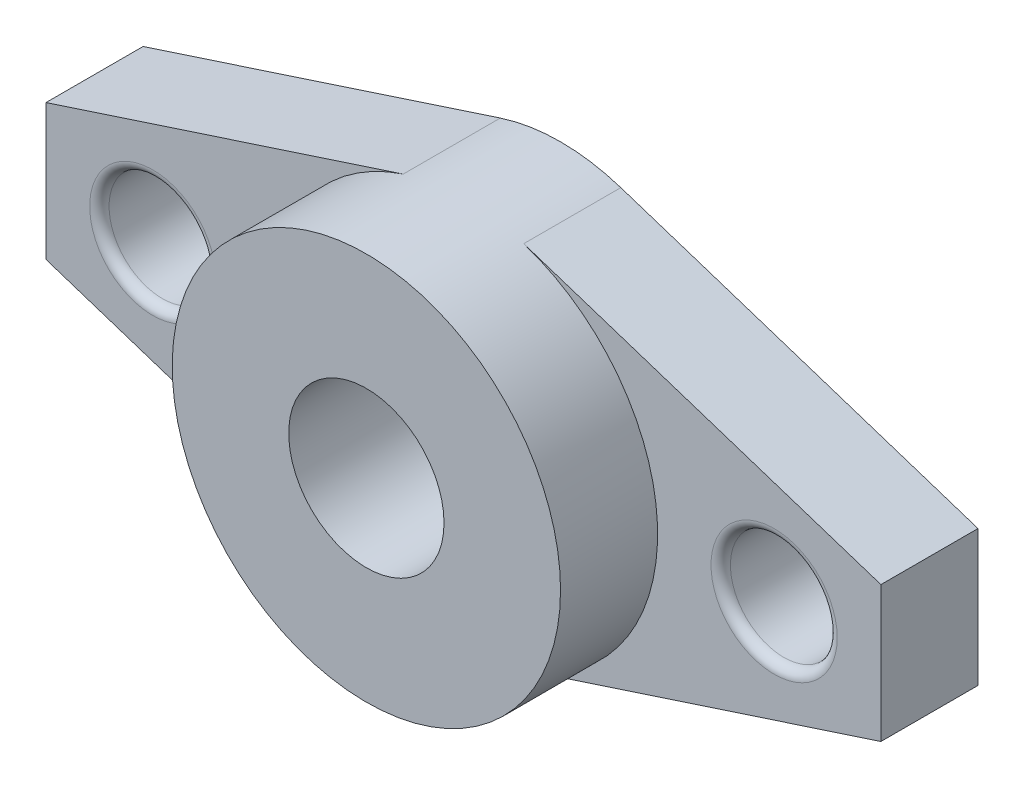
ISO-10303-21;
HEADER;
FILE_DESCRIPTION(('STEP AP214'),'2;1');
FILE_NAME('part.step','',(''),(''),'','','');
FILE_SCHEMA(('AUTOMOTIVE_DESIGN { 1 0 10303 214 1 1 1 1 }'));
ENDSEC;
DATA;
#1=APPLICATION_CONTEXT('core data for automotive mechanical design processes');
#2=APPLICATION_PROTOCOL_DEFINITION('international standard','automotive_design',2000,#1);
#3=PRODUCT_CONTEXT('',#1,'mechanical');
#4=PRODUCT('Part','Part','',(#3));
#5=PRODUCT_RELATED_PRODUCT_CATEGORY('part','',(#4));
#6=PRODUCT_DEFINITION_FORMATION('','',#4);
#7=PRODUCT_DEFINITION_CONTEXT('part definition',#1,'design');
#8=PRODUCT_DEFINITION('design','',#6,#7);
#9=PRODUCT_DEFINITION_SHAPE('','',#8);
#10=(LENGTH_UNIT() NAMED_UNIT(*) SI_UNIT(.MILLI.,.METRE.));
#11=(NAMED_UNIT(*) PLANE_ANGLE_UNIT() SI_UNIT($,.RADIAN.));
#12=(NAMED_UNIT(*) SI_UNIT($,.STERADIAN.) SOLID_ANGLE_UNIT());
#13=UNCERTAINTY_MEASURE_WITH_UNIT(LENGTH_MEASURE(1.E-05),#10,'distance_accuracy_value','');
#14=(GEOMETRIC_REPRESENTATION_CONTEXT(3) GLOBAL_UNCERTAINTY_ASSIGNED_CONTEXT((#13)) GLOBAL_UNIT_ASSIGNED_CONTEXT((#10,
#11,#12)) REPRESENTATION_CONTEXT('',''));
#15=CARTESIAN_POINT('',(0.,0.,0.));
#16=DIRECTION('',(0.,0.,1.));
#17=DIRECTION('',(1.,0.,0.));
#18=AXIS2_PLACEMENT_3D('',#15,#16,#17);
#19=CARTESIAN_POINT('',(0.,0.,10.));
#20=DIRECTION('',(0.,0.,-1.));
#21=DIRECTION('',(-1.,0.,0.));
#22=AXIS2_PLACEMENT_3D('',#19,#20,#21);
#23=CYLINDRICAL_SURFACE('',#22,10.);
#24=CARTESIAN_POINT('',(0.,0.,10.));
#25=DIRECTION('',(0.,0.,1.));
#26=DIRECTION('',(1.,0.,0.));
#27=AXIS2_PLACEMENT_3D('',#24,#25,#26);
#28=CIRCLE('',#27,10.);
#29=CARTESIAN_POINT('',(10.,0.,10.));
#30=VERTEX_POINT('',#29);
#31=EDGE_CURVE('E167',#30,#30,#28,.T.);
#32=ORIENTED_EDGE('',*,*,#31,.F.);
#33=EDGE_LOOP('',(#32));
#34=FACE_BOUND('',#33,.T.);
#35=DIRECTION('',(0.,0.,-1.));
#36=VECTOR('',#35,1.);
#37=CARTESIAN_POINT('',(-3.10364576014178,9.50617604484337,5.));
#38=LINE('',#37,#36);
#39=CARTESIAN_POINT('',(-3.10364576014178,9.50617604484337,5.));
#40=VERTEX_POINT('',#39);
#41=CARTESIAN_POINT('',(-3.10364576014178,9.50617604484337,0.));
#42=VERTEX_POINT('',#41);
#43=EDGE_CURVE('E68',#40,#42,#38,.T.);
#44=ORIENTED_EDGE('',*,*,#43,.F.);
#45=CARTESIAN_POINT('',(0.,0.,5.));
#46=DIRECTION('',(0.,0.,1.));
#47=DIRECTION('',(1.,0.,0.));
#48=AXIS2_PLACEMENT_3D('',#45,#46,#47);
#49=CIRCLE('',#48,10.);
#50=CARTESIAN_POINT('',(-3.10364576014178,-9.50617604484337,5.));
#51=VERTEX_POINT('',#50);
#52=EDGE_CURVE('E63',#40,#51,#49,.T.);
#53=ORIENTED_EDGE('',*,*,#52,.T.);
#54=DIRECTION('',(0.,0.,-1.));
#55=VECTOR('',#54,1.);
#56=CARTESIAN_POINT('',(-3.10364576014178,-9.50617604484337,5.));
#57=LINE('',#56,#55);
#58=CARTESIAN_POINT('',(-3.10364576014178,-9.50617604484337,0.));
#59=VERTEX_POINT('',#58);
#60=EDGE_CURVE('E143',#51,#59,#57,.T.);
#61=ORIENTED_EDGE('',*,*,#60,.T.);
#62=CARTESIAN_POINT('',(0.,0.,0.));
#63=DIRECTION('',(0.,0.,1.));
#64=DIRECTION('',(1.,0.,0.));
#65=AXIS2_PLACEMENT_3D('',#62,#63,#64);
#66=CIRCLE('',#65,10.);
#67=CARTESIAN_POINT('',(3.10364576014178,-9.50617604484337,0.));
#68=VERTEX_POINT('',#67);
#69=EDGE_CURVE('E176',#59,#68,#66,.T.);
#70=ORIENTED_EDGE('',*,*,#69,.T.);
#71=DIRECTION('',(0.,0.,-1.));
#72=VECTOR('',#71,1.);
#73=CARTESIAN_POINT('',(3.10364576014178,-9.50617604484337,5.));
#74=LINE('',#73,#72);
#75=CARTESIAN_POINT('',(3.10364576014178,-9.50617604484337,5.));
#76=VERTEX_POINT('',#75);
#77=EDGE_CURVE('E219',#76,#68,#74,.T.);
#78=ORIENTED_EDGE('',*,*,#77,.F.);
#79=CARTESIAN_POINT('',(0.,0.,5.));
#80=DIRECTION('',(0.,0.,1.));
#81=DIRECTION('',(1.,0.,0.));
#82=AXIS2_PLACEMENT_3D('',#79,#80,#81);
#83=CIRCLE('',#82,10.);
#84=CARTESIAN_POINT('',(3.10364576014178,9.50617604484337,5.));
#85=VERTEX_POINT('',#84);
#86=EDGE_CURVE('E179',#76,#85,#83,.T.);
#87=ORIENTED_EDGE('',*,*,#86,.T.);
#88=DIRECTION('',(0.,0.,-1.));
#89=VECTOR('',#88,1.);
#90=CARTESIAN_POINT('',(3.10364576014178,9.50617604484337,5.));
#91=LINE('',#90,#89);
#92=CARTESIAN_POINT('',(3.10364576014178,9.50617604484337,0.));
#93=VERTEX_POINT('',#92);
#94=EDGE_CURVE('E195',#85,#93,#91,.T.);
#95=ORIENTED_EDGE('',*,*,#94,.T.);
#96=EDGE_CURVE('E168',#93,#42,#66,.T.);
#97=ORIENTED_EDGE('',*,*,#96,.T.);
#98=EDGE_LOOP('',(#44,#53,#61,#70,#78,#87,#95,#97));
#99=FACE_BOUND('',#98,.T.);
#100=ADVANCED_FACE('F47',(#34,#99),#23,.T.);
#101=CARTESIAN_POINT('',(3.10364576014178,-9.50617604484337,5.));
#102=DIRECTION('',(0.310364576014178,-0.950617604484337,0.));
#103=DIRECTION('',(0.950617604484337,0.310364576014178,0.));
#104=AXIS2_PLACEMENT_3D('',#101,#102,#103);
#105=PLANE('',#104);
#106=DIRECTION('',(-0.950617604484337,-0.310364576014178,0.));
#107=VECTOR('',#106,1.);
#108=CARTESIAN_POINT('',(3.10364576014178,-9.50617604484337,0.));
#109=LINE('',#108,#107);
#110=CARTESIAN_POINT('',(21.5,-3.5,0.));
#111=VERTEX_POINT('',#110);
#112=EDGE_CURVE('E199',#111,#68,#109,.T.);
#113=ORIENTED_EDGE('',*,*,#112,.F.);
#114=DIRECTION('',(0.,0.,-1.));
#115=VECTOR('',#114,1.);
#116=CARTESIAN_POINT('',(21.5,-3.5,5.));
#117=LINE('',#116,#115);
#118=CARTESIAN_POINT('',(21.5,-3.5,5.));
#119=VERTEX_POINT('',#118);
#120=EDGE_CURVE('E216',#119,#111,#117,.T.);
#121=ORIENTED_EDGE('',*,*,#120,.F.);
#122=DIRECTION('',(-0.950617604484337,-0.310364576014178,0.));
#123=VECTOR('',#122,1.);
#124=CARTESIAN_POINT('',(3.10364576014178,-9.50617604484337,5.));
#125=LINE('',#124,#123);
#126=EDGE_CURVE('E182',#119,#76,#125,.T.);
#127=ORIENTED_EDGE('',*,*,#126,.T.);
#128=ORIENTED_EDGE('',*,*,#77,.T.);
#129=EDGE_LOOP('',(#113,#121,#127,#128));
#130=FACE_BOUND('',#129,.T.);
#131=ADVANCED_FACE('F247',(#130),#105,.T.);
#132=CARTESIAN_POINT('',(21.5,0.,5.));
#133=DIRECTION('',(1.,0.,0.));
#134=DIRECTION('',(0.,0.,-1.));
#135=AXIS2_PLACEMENT_3D('',#132,#133,#134);
#136=PLANE('',#135);
#137=DIRECTION('',(0.,-1.,0.));
#138=VECTOR('',#137,1.);
#139=CARTESIAN_POINT('',(21.5,0.,0.));
#140=LINE('',#139,#138);
#141=CARTESIAN_POINT('',(21.5,3.5,0.));
#142=VERTEX_POINT('',#141);
#143=EDGE_CURVE('E203',#142,#111,#140,.T.);
#144=ORIENTED_EDGE('',*,*,#143,.F.);
#145=DIRECTION('',(0.,0.,-1.));
#146=VECTOR('',#145,1.);
#147=CARTESIAN_POINT('',(21.5,3.5,5.));
#148=LINE('',#147,#146);
#149=CARTESIAN_POINT('',(21.5,3.5,5.));
#150=VERTEX_POINT('',#149);
#151=EDGE_CURVE('E213',#150,#142,#148,.T.);
#152=ORIENTED_EDGE('',*,*,#151,.F.);
#153=DIRECTION('',(0.,-1.,0.));
#154=VECTOR('',#153,1.);
#155=CARTESIAN_POINT('',(21.5,0.,5.));
#156=LINE('',#155,#154);
#157=EDGE_CURVE('E187',#150,#119,#156,.T.);
#158=ORIENTED_EDGE('',*,*,#157,.T.);
#159=ORIENTED_EDGE('',*,*,#120,.T.);
#160=EDGE_LOOP('',(#144,#152,#158,#159));
#161=FACE_BOUND('',#160,.T.);
#162=ADVANCED_FACE('F254',(#161),#136,.T.);
#163=CARTESIAN_POINT('',(16.,0.,5.));
#164=DIRECTION('',(0.,0.,-1.));
#165=DIRECTION('',(-1.,0.,0.));
#166=AXIS2_PLACEMENT_3D('',#163,#164,#165);
#167=CYLINDRICAL_SURFACE('',#166,2.75);
#168=CARTESIAN_POINT('',(16.,0.,4.5));
#169=DIRECTION('',(0.,0.,1.));
#170=DIRECTION('',(1.,0.,0.));
#171=AXIS2_PLACEMENT_3D('',#168,#169,#170);
#172=CIRCLE('',#171,2.75);
#173=CARTESIAN_POINT('',(18.75,0.,4.5));
#174=VERTEX_POINT('',#173);
#175=EDGE_CURVE('E56',#174,#174,#172,.T.);
#176=ORIENTED_EDGE('',*,*,#175,.T.);
#177=EDGE_LOOP('',(#176));
#178=FACE_BOUND('',#177,.T.);
#179=CARTESIAN_POINT('',(16.,0.,0.));
#180=DIRECTION('',(0.,0.,1.));
#181=DIRECTION('',(1.,0.,0.));
#182=AXIS2_PLACEMENT_3D('',#179,#180,#181);
#183=CIRCLE('',#182,2.75);
#184=CARTESIAN_POINT('',(18.75,0.,0.));
#185=VERTEX_POINT('',#184);
#186=EDGE_CURVE('E172',#185,#185,#183,.T.);
#187=ORIENTED_EDGE('',*,*,#186,.F.);
#188=EDGE_LOOP('',(#187));
#189=FACE_BOUND('',#188,.T.);
#190=ADVANCED_FACE('F234',(#178,#189),#167,.F.);
#191=CARTESIAN_POINT('',(3.10364576014178,9.50617604484337,5.));
#192=DIRECTION('',(-0.310364576014178,-0.950617604484337,0.));
#193=DIRECTION('',(0.950617604484337,-0.310364576014178,0.));
#194=AXIS2_PLACEMENT_3D('',#191,#192,#193);
#195=PLANE('',#194);
#196=DIRECTION('',(-0.950617604484337,0.310364576014178,0.));
#197=VECTOR('',#196,1.);
#198=CARTESIAN_POINT('',(3.10364576014178,9.50617604484337,0.));
#199=LINE('',#198,#197);
#200=EDGE_CURVE('E183',#142,#93,#199,.T.);
#201=ORIENTED_EDGE('',*,*,#200,.T.);
#202=ORIENTED_EDGE('',*,*,#94,.F.);
#203=DIRECTION('',(-0.950617604484337,0.310364576014178,0.));
#204=VECTOR('',#203,1.);
#205=CARTESIAN_POINT('',(3.10364576014178,9.50617604484337,5.));
#206=LINE('',#205,#204);
#207=EDGE_CURVE('E191',#150,#85,#206,.T.);
#208=ORIENTED_EDGE('',*,*,#207,.F.);
#209=ORIENTED_EDGE('',*,*,#151,.T.);
#210=EDGE_LOOP('',(#201,#202,#208,#209));
#211=FACE_BOUND('',#210,.T.);
#212=ADVANCED_FACE('F269',(#211),#195,.F.);
#213=CARTESIAN_POINT('',(0.,0.,5.));
#214=DIRECTION('',(0.,0.,1.));
#215=DIRECTION('',(1.,0.,0.));
#216=AXIS2_PLACEMENT_3D('',#213,#214,#215);
#217=PLANE('',#216);
#218=CARTESIAN_POINT('',(16.,0.,5.));
#219=DIRECTION('',(0.,0.,1.));
#220=DIRECTION('',(1.,0.,0.));
#221=AXIS2_PLACEMENT_3D('',#218,#219,#220);
#222=CIRCLE('',#221,3.25);
#223=CARTESIAN_POINT('',(19.25,0.,5.));
#224=VERTEX_POINT('',#223);
#225=EDGE_CURVE('E11',#224,#224,#222,.F.);
#226=ORIENTED_EDGE('',*,*,#225,.T.);
#227=EDGE_LOOP('',(#226));
#228=FACE_BOUND('',#227,.T.);
#229=ORIENTED_EDGE('',*,*,#86,.F.);
#230=ORIENTED_EDGE('',*,*,#126,.F.);
#231=ORIENTED_EDGE('',*,*,#157,.F.);
#232=ORIENTED_EDGE('',*,*,#207,.T.);
#233=EDGE_LOOP('',(#229,#230,#231,#232));
#234=FACE_BOUND('',#233,.T.);
#235=ADVANCED_FACE('F267',(#228,#234),#217,.T.);
#236=CARTESIAN_POINT('',(0.,0.,0.));
#237=DIRECTION('',(0.,0.,1.));
#238=DIRECTION('',(1.,0.,0.));
#239=AXIS2_PLACEMENT_3D('',#236,#237,#238);
#240=PLANE('',#239);
#241=ORIENTED_EDGE('',*,*,#186,.T.);
#242=EDGE_LOOP('',(#241));
#243=FACE_BOUND('',#242,.T.);
#244=ORIENTED_EDGE('',*,*,#112,.T.);
#245=ORIENTED_EDGE('',*,*,#69,.F.);
#246=DIRECTION('',(0.950617604484337,-0.310364576014178,0.));
#247=VECTOR('',#246,1.);
#248=CARTESIAN_POINT('',(-3.10364576014178,-9.50617604484337,0.));
#249=LINE('',#248,#247);
#250=CARTESIAN_POINT('',(-21.5,-3.5,0.));
#251=VERTEX_POINT('',#250);
#252=EDGE_CURVE('E138',#251,#59,#249,.T.);
#253=ORIENTED_EDGE('',*,*,#252,.F.);
#254=DIRECTION('',(0.,-1.,0.));
#255=VECTOR('',#254,1.);
#256=CARTESIAN_POINT('',(-21.5,0.,0.));
#257=LINE('',#256,#255);
#258=CARTESIAN_POINT('',(-21.5,3.5,0.));
#259=VERTEX_POINT('',#258);
#260=EDGE_CURVE('E150',#259,#251,#257,.T.);
#261=ORIENTED_EDGE('',*,*,#260,.F.);
#262=DIRECTION('',(0.950617604484337,0.310364576014178,0.));
#263=VECTOR('',#262,1.);
#264=CARTESIAN_POINT('',(-3.10364576014178,9.50617604484337,0.));
#265=LINE('',#264,#263);
#266=EDGE_CURVE('E118',#259,#42,#265,.T.);
#267=ORIENTED_EDGE('',*,*,#266,.T.);
#268=ORIENTED_EDGE('',*,*,#96,.F.);
#269=ORIENTED_EDGE('',*,*,#200,.F.);
#270=ORIENTED_EDGE('',*,*,#143,.T.);
#271=EDGE_LOOP('',(#244,#245,#253,#261,#267,#268,#269,#270));
#272=FACE_BOUND('',#271,.T.);
#273=CARTESIAN_POINT('',(0.,0.,0.));
#274=DIRECTION('',(0.,0.,1.));
#275=DIRECTION('',(1.,0.,0.));
#276=AXIS2_PLACEMENT_3D('',#273,#274,#275);
#277=CIRCLE('',#276,4.);
#278=CARTESIAN_POINT('',(4.,0.,0.));
#279=VERTEX_POINT('',#278);
#280=EDGE_CURVE('E162',#279,#279,#277,.T.);
#281=ORIENTED_EDGE('',*,*,#280,.T.);
#282=EDGE_LOOP('',(#281));
#283=FACE_BOUND('',#282,.T.);
#284=CARTESIAN_POINT('',(-16.,0.,0.));
#285=DIRECTION('',(0.,0.,1.));
#286=DIRECTION('',(1.,0.,0.));
#287=AXIS2_PLACEMENT_3D('',#284,#285,#286);
#288=CIRCLE('',#287,2.75);
#289=CARTESIAN_POINT('',(-13.25,0.,0.));
#290=VERTEX_POINT('',#289);
#291=EDGE_CURVE('E144',#290,#290,#288,.T.);
#292=ORIENTED_EDGE('',*,*,#291,.T.);
#293=EDGE_LOOP('',(#292));
#294=FACE_BOUND('',#293,.T.);
#295=ADVANCED_FACE('F265',(#243,#272,#283,#294),#240,.F.);
#296=CARTESIAN_POINT('',(0.,0.,10.));
#297=DIRECTION('',(0.,0.,-1.));
#298=DIRECTION('',(-1.,0.,0.));
#299=AXIS2_PLACEMENT_3D('',#296,#297,#298);
#300=CYLINDRICAL_SURFACE('',#299,4.);
#301=CARTESIAN_POINT('',(0.,0.,10.));
#302=DIRECTION('',(0.,0.,1.));
#303=DIRECTION('',(1.,0.,0.));
#304=AXIS2_PLACEMENT_3D('',#301,#302,#303);
#305=CIRCLE('',#304,4.);
#306=CARTESIAN_POINT('',(4.,0.,10.));
#307=VERTEX_POINT('',#306);
#308=EDGE_CURVE('E163',#307,#307,#305,.T.);
#309=ORIENTED_EDGE('',*,*,#308,.T.);
#310=EDGE_LOOP('',(#309));
#311=FACE_BOUND('',#310,.T.);
#312=ORIENTED_EDGE('',*,*,#280,.F.);
#313=EDGE_LOOP('',(#312));
#314=FACE_BOUND('',#313,.T.);
#315=ADVANCED_FACE('F262',(#311,#314),#300,.F.);
#316=CARTESIAN_POINT('',(0.,0.,10.));
#317=DIRECTION('',(0.,0.,1.));
#318=DIRECTION('',(1.,0.,0.));
#319=AXIS2_PLACEMENT_3D('',#316,#317,#318);
#320=PLANE('',#319);
#321=ORIENTED_EDGE('',*,*,#308,.F.);
#322=EDGE_LOOP('',(#321));
#323=FACE_BOUND('',#322,.T.);
#324=ORIENTED_EDGE('',*,*,#31,.T.);
#325=EDGE_LOOP('',(#324));
#326=FACE_BOUND('',#325,.T.);
#327=ADVANCED_FACE('F260',(#323,#326),#320,.T.);
#328=CARTESIAN_POINT('',(-3.10364576014178,9.50617604484337,5.));
#329=DIRECTION('',(-0.310364576014178,0.950617604484337,0.));
#330=DIRECTION('',(-0.950617604484337,-0.310364576014178,0.));
#331=AXIS2_PLACEMENT_3D('',#328,#329,#330);
#332=PLANE('',#331);
#333=ORIENTED_EDGE('',*,*,#266,.F.);
#334=DIRECTION('',(0.,0.,-1.));
#335=VECTOR('',#334,1.);
#336=CARTESIAN_POINT('',(-21.5,3.5,5.));
#337=LINE('',#336,#335);
#338=CARTESIAN_POINT('',(-21.5,3.5,5.));
#339=VERTEX_POINT('',#338);
#340=EDGE_CURVE('E112',#339,#259,#337,.T.);
#341=ORIENTED_EDGE('',*,*,#340,.F.);
#342=DIRECTION('',(0.950617604484337,0.310364576014178,0.));
#343=VECTOR('',#342,1.);
#344=CARTESIAN_POINT('',(-3.10364576014178,9.50617604484337,5.));
#345=LINE('',#344,#343);
#346=EDGE_CURVE('E116',#339,#40,#345,.T.);
#347=ORIENTED_EDGE('',*,*,#346,.T.);
#348=ORIENTED_EDGE('',*,*,#43,.T.);
#349=EDGE_LOOP('',(#333,#341,#347,#348));
#350=FACE_BOUND('',#349,.T.);
#351=ADVANCED_FACE('F114',(#350),#332,.T.);
#352=CARTESIAN_POINT('',(-21.5,0.,5.));
#353=DIRECTION('',(1.,0.,0.));
#354=DIRECTION('',(0.,0.,-1.));
#355=AXIS2_PLACEMENT_3D('',#352,#353,#354);
#356=PLANE('',#355);
#357=ORIENTED_EDGE('',*,*,#260,.T.);
#358=DIRECTION('',(0.,0.,-1.));
#359=VECTOR('',#358,1.);
#360=CARTESIAN_POINT('',(-21.5,-3.5,5.));
#361=LINE('',#360,#359);
#362=CARTESIAN_POINT('',(-21.5,-3.5,5.));
#363=VERTEX_POINT('',#362);
#364=EDGE_CURVE('E123',#363,#251,#361,.T.);
#365=ORIENTED_EDGE('',*,*,#364,.F.);
#366=DIRECTION('',(0.,-1.,0.));
#367=VECTOR('',#366,1.);
#368=CARTESIAN_POINT('',(-21.5,0.,5.));
#369=LINE('',#368,#367);
#370=EDGE_CURVE('E127',#339,#363,#369,.T.);
#371=ORIENTED_EDGE('',*,*,#370,.F.);
#372=ORIENTED_EDGE('',*,*,#340,.T.);
#373=EDGE_LOOP('',(#357,#365,#371,#372));
#374=FACE_BOUND('',#373,.T.);
#375=ADVANCED_FACE('F128',(#374),#356,.F.);
#376=CARTESIAN_POINT('',(-16.,0.,5.));
#377=DIRECTION('',(0.,0.,-1.));
#378=DIRECTION('',(-1.,0.,0.));
#379=AXIS2_PLACEMENT_3D('',#376,#377,#378);
#380=CYLINDRICAL_SURFACE('',#379,2.75);
#381=CARTESIAN_POINT('',(-16.,0.,4.5));
#382=DIRECTION('',(0.,0.,1.));
#383=DIRECTION('',(1.,0.,0.));
#384=AXIS2_PLACEMENT_3D('',#381,#382,#383);
#385=CIRCLE('',#384,2.75);
#386=CARTESIAN_POINT('',(-13.25,0.,4.5));
#387=VERTEX_POINT('',#386);
#388=EDGE_CURVE('E223',#387,#387,#385,.T.);
#389=ORIENTED_EDGE('',*,*,#388,.T.);
#390=EDGE_LOOP('',(#389));
#391=FACE_BOUND('',#390,.T.);
#392=ORIENTED_EDGE('',*,*,#291,.F.);
#393=EDGE_LOOP('',(#392));
#394=FACE_BOUND('',#393,.T.);
#395=ADVANCED_FACE('F322',(#391,#394),#380,.F.);
#396=CARTESIAN_POINT('',(-3.10364576014178,-9.50617604484337,5.));
#397=DIRECTION('',(0.310364576014178,0.950617604484337,0.));
#398=DIRECTION('',(-0.950617604484337,0.310364576014178,0.));
#399=AXIS2_PLACEMENT_3D('',#396,#397,#398);
#400=PLANE('',#399);
#401=ORIENTED_EDGE('',*,*,#252,.T.);
#402=ORIENTED_EDGE('',*,*,#60,.F.);
#403=DIRECTION('',(0.950617604484337,-0.310364576014178,0.));
#404=VECTOR('',#403,1.);
#405=CARTESIAN_POINT('',(-3.10364576014178,-9.50617604484337,5.));
#406=LINE('',#405,#404);
#407=EDGE_CURVE('E132',#363,#51,#406,.T.);
#408=ORIENTED_EDGE('',*,*,#407,.F.);
#409=ORIENTED_EDGE('',*,*,#364,.T.);
#410=EDGE_LOOP('',(#401,#402,#408,#409));
#411=FACE_BOUND('',#410,.T.);
#412=ADVANCED_FACE('F330',(#411),#400,.F.);
#413=CARTESIAN_POINT('',(0.,0.,5.));
#414=DIRECTION('',(0.,0.,1.));
#415=DIRECTION('',(1.,0.,0.));
#416=AXIS2_PLACEMENT_3D('',#413,#414,#415);
#417=PLANE('',#416);
#418=CARTESIAN_POINT('',(-16.,0.,5.));
#419=DIRECTION('',(0.,0.,1.));
#420=DIRECTION('',(1.,0.,0.));
#421=AXIS2_PLACEMENT_3D('',#418,#419,#420);
#422=CIRCLE('',#421,3.25);
#423=CARTESIAN_POINT('',(-12.75,0.,5.));
#424=VERTEX_POINT('',#423);
#425=EDGE_CURVE('E227',#424,#424,#422,.F.);
#426=ORIENTED_EDGE('',*,*,#425,.T.);
#427=EDGE_LOOP('',(#426));
#428=FACE_BOUND('',#427,.T.);
#429=ORIENTED_EDGE('',*,*,#52,.F.);
#430=ORIENTED_EDGE('',*,*,#346,.F.);
#431=ORIENTED_EDGE('',*,*,#370,.T.);
#432=ORIENTED_EDGE('',*,*,#407,.T.);
#433=EDGE_LOOP('',(#429,#430,#431,#432));
#434=FACE_BOUND('',#433,.T.);
#435=ADVANCED_FACE('F134',(#428,#434),#417,.T.);
#436=CARTESIAN_POINT('',(-16.,0.,4.5));
#437=DIRECTION('',(0.,0.,1.));
#438=DIRECTION('',(1.,0.,0.));
#439=AXIS2_PLACEMENT_3D('',#436,#437,#438);
#440=TOROIDAL_SURFACE('',#439,3.25,0.5);
#441=ORIENTED_EDGE('',*,*,#425,.F.);
#442=EDGE_LOOP('',(#441));
#443=FACE_BOUND('',#442,.T.);
#444=ORIENTED_EDGE('',*,*,#388,.F.);
#445=EDGE_LOOP('',(#444));
#446=FACE_BOUND('',#445,.T.);
#447=ADVANCED_FACE('F238',(#443,#446),#440,.T.);
#448=CARTESIAN_POINT('',(16.,0.,4.5));
#449=DIRECTION('',(0.,0.,1.));
#450=DIRECTION('',(1.,0.,0.));
#451=AXIS2_PLACEMENT_3D('',#448,#449,#450);
#452=TOROIDAL_SURFACE('',#451,3.25,0.5);
#453=ORIENTED_EDGE('',*,*,#225,.F.);
#454=EDGE_LOOP('',(#453));
#455=FACE_BOUND('',#454,.T.);
#456=ORIENTED_EDGE('',*,*,#175,.F.);
#457=EDGE_LOOP('',(#456));
#458=FACE_BOUND('',#457,.T.);
#459=ADVANCED_FACE('F49',(#455,#458),#452,.T.);
#460=CLOSED_SHELL('',(#100,#131,#162,#190,#212,#235,#295,#315,#327,#351,#375,#395,#412,#435,
#447,#459));
#461=MANIFOLD_SOLID_BREP('B2',#460);
#462=ADVANCED_BREP_SHAPE_REPRESENTATION('',(#18,#461),#14);
#463=SHAPE_DEFINITION_REPRESENTATION(#9,#462);
ENDSEC;
END-ISO-10303-21;
